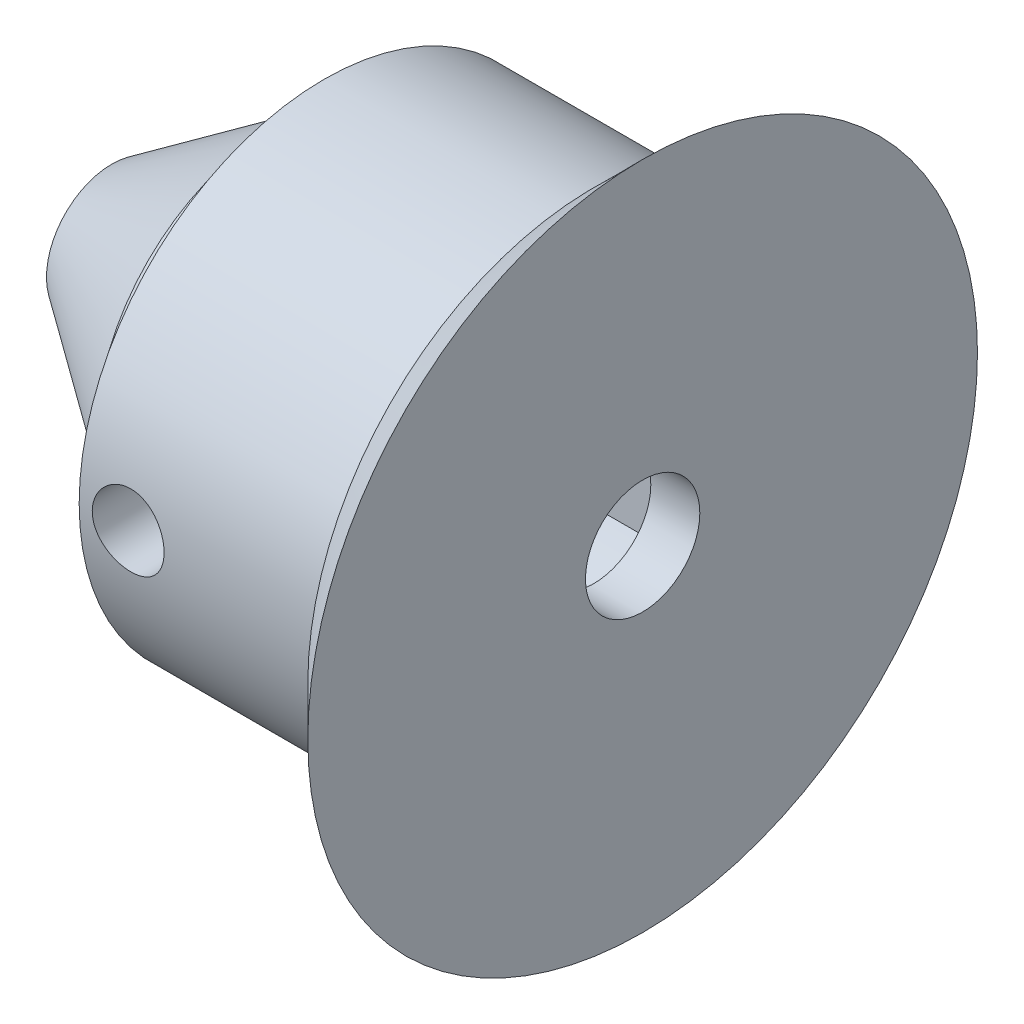
ISO-10303-21;
HEADER;
FILE_DESCRIPTION(('STEP AP214'),'2;1');
FILE_NAME('part.step','',(''),(''),'','','');
FILE_SCHEMA(('AUTOMOTIVE_DESIGN { 1 0 10303 214 1 1 1 1 }'));
ENDSEC;
DATA;
#1=APPLICATION_CONTEXT('core data for automotive mechanical design processes');
#2=APPLICATION_PROTOCOL_DEFINITION('international standard','automotive_design',2000,#1);
#3=PRODUCT_CONTEXT('',#1,'mechanical');
#4=PRODUCT('Part','Part','',(#3));
#5=PRODUCT_RELATED_PRODUCT_CATEGORY('part','',(#4));
#6=PRODUCT_DEFINITION_FORMATION('','',#4);
#7=PRODUCT_DEFINITION_CONTEXT('part definition',#1,'design');
#8=PRODUCT_DEFINITION('design','',#6,#7);
#9=PRODUCT_DEFINITION_SHAPE('','',#8);
#10=(LENGTH_UNIT() NAMED_UNIT(*) SI_UNIT(.MILLI.,.METRE.));
#11=(NAMED_UNIT(*) PLANE_ANGLE_UNIT() SI_UNIT($,.RADIAN.));
#12=(NAMED_UNIT(*) SI_UNIT($,.STERADIAN.) SOLID_ANGLE_UNIT());
#13=UNCERTAINTY_MEASURE_WITH_UNIT(LENGTH_MEASURE(1.E-05),#10,'distance_accuracy_value','');
#14=(GEOMETRIC_REPRESENTATION_CONTEXT(3) GLOBAL_UNCERTAINTY_ASSIGNED_CONTEXT((#13)) GLOBAL_UNIT_ASSIGNED_CONTEXT((#10,
#11,#12)) REPRESENTATION_CONTEXT('',''));
#15=CARTESIAN_POINT('',(0.,0.,0.));
#16=DIRECTION('',(0.,0.,1.));
#17=DIRECTION('',(1.,0.,0.));
#18=AXIS2_PLACEMENT_3D('',#15,#16,#17);
#19=CARTESIAN_POINT('',(1.00000000000001,0.,-125.));
#20=DIRECTION('',(1.,0.,0.));
#21=DIRECTION('',(0.,0.,-1.));
#22=AXIS2_PLACEMENT_3D('',#19,#20,#21);
#23=PLANE('',#22);
#24=CARTESIAN_POINT('',(1.00000000000001,0.,-125.));
#25=DIRECTION('',(1.,0.,0.));
#26=DIRECTION('',(0.,0.,-1.));
#27=AXIS2_PLACEMENT_3D('',#24,#25,#26);
#28=CIRCLE('',#27,7.50000000000001);
#29=CARTESIAN_POINT('',(1.00000000000001,0.,-132.5));
#30=VERTEX_POINT('',#29);
#31=EDGE_CURVE('E118',#30,#30,#28,.F.);
#32=ORIENTED_EDGE('',*,*,#31,.F.);
#33=EDGE_LOOP('',(#32));
#34=FACE_BOUND('',#33,.T.);
#35=CARTESIAN_POINT('',(1.00000000000001,0.,-125.));
#36=DIRECTION('',(-1.,0.,0.));
#37=DIRECTION('',(0.,0.,1.));
#38=AXIS2_PLACEMENT_3D('',#35,#36,#37);
#39=CIRCLE('',#38,8.74999999999998);
#40=CARTESIAN_POINT('',(1.00000000000001,0.,-116.25));
#41=VERTEX_POINT('',#40);
#42=EDGE_CURVE('E259',#41,#41,#39,.T.);
#43=ORIENTED_EDGE('',*,*,#42,.T.);
#44=EDGE_LOOP('',(#43));
#45=FACE_BOUND('',#44,.T.);
#46=ADVANCED_FACE('F39',(#34,#45),#23,.F.);
#47=CARTESIAN_POINT('',(2.50000000000001,0.,-125.));
#48=DIRECTION('',(1.,0.,0.));
#49=DIRECTION('',(0.,0.,-1.));
#50=AXIS2_PLACEMENT_3D('',#47,#48,#49);
#51=PLANE('',#50);
#52=CARTESIAN_POINT('',(2.50000000000001,0.,-125.));
#53=DIRECTION('',(1.,0.,0.));
#54=DIRECTION('',(0.,0.,-1.));
#55=AXIS2_PLACEMENT_3D('',#52,#53,#54);
#56=CIRCLE('',#55,1.75000000000001);
#57=CARTESIAN_POINT('',(2.50000000000001,0.,-126.75));
#58=VERTEX_POINT('',#57);
#59=EDGE_CURVE('E130',#58,#58,#56,.T.);
#60=ORIENTED_EDGE('',*,*,#59,.F.);
#61=EDGE_LOOP('',(#60));
#62=FACE_BOUND('',#61,.T.);
#63=CARTESIAN_POINT('',(2.50000000000001,0.,-125.));
#64=DIRECTION('',(-1.,0.,0.));
#65=DIRECTION('',(0.,0.,1.));
#66=AXIS2_PLACEMENT_3D('',#63,#64,#65);
#67=CIRCLE('',#66,10.25);
#68=CARTESIAN_POINT('',(2.50000000000001,0.,-114.75));
#69=VERTEX_POINT('',#68);
#70=EDGE_CURVE('E262',#69,#69,#67,.T.);
#71=ORIENTED_EDGE('',*,*,#70,.F.);
#72=EDGE_LOOP('',(#71));
#73=FACE_BOUND('',#72,.T.);
#74=ADVANCED_FACE('F178',(#62,#73),#51,.T.);
#75=CARTESIAN_POINT('',(-7.24999999999999,0.,-125.));
#76=DIRECTION('',(-1.,0.,0.));
#77=DIRECTION('',(0.,0.,1.));
#78=AXIS2_PLACEMENT_3D('',#75,#76,#77);
#79=PLANE('',#78);
#80=CARTESIAN_POINT('',(-7.24999999999999,0.,-125.));
#81=DIRECTION('',(-1.,0.,0.));
#82=DIRECTION('',(0.,0.,1.));
#83=AXIS2_PLACEMENT_3D('',#80,#81,#82);
#84=CIRCLE('',#83,7.43649167310373);
#85=CARTESIAN_POINT('',(-7.24999999999999,0.,-117.563508326896));
#86=VERTEX_POINT('',#85);
#87=EDGE_CURVE('E11',#86,#86,#84,.F.);
#88=ORIENTED_EDGE('',*,*,#87,.T.);
#89=EDGE_LOOP('',(#88));
#90=FACE_BOUND('',#89,.T.);
#91=CARTESIAN_POINT('',(-7.24999999999999,0.,-125.));
#92=DIRECTION('',(-1.,0.,0.));
#93=DIRECTION('',(0.,0.,1.));
#94=AXIS2_PLACEMENT_3D('',#91,#92,#93);
#95=CIRCLE('',#94,7.50000000000001);
#96=CARTESIAN_POINT('',(-7.24999999999999,0.,-117.5));
#97=VERTEX_POINT('',#96);
#98=EDGE_CURVE('E115',#97,#97,#95,.T.);
#99=ORIENTED_EDGE('',*,*,#98,.T.);
#100=EDGE_LOOP('',(#99));
#101=FACE_BOUND('',#100,.T.);
#102=ADVANCED_FACE('F163',(#90,#101),#79,.T.);
#103=CARTESIAN_POINT('',(-7.24999999999999,0.,-125.));
#104=DIRECTION('',(1.,0.,0.));
#105=DIRECTION('',(0.,0.,-1.));
#106=AXIS2_PLACEMENT_3D('',#103,#104,#105);
#107=CYLINDRICAL_SURFACE('',#106,7.50000000000001);
#108=CARTESIAN_POINT('',(-6.85000000000008,0.,-132.5));
#109=CARTESIAN_POINT('',(-6.84999745450659,-0.0614339137792255,-132.499999030787));
#110=CARTESIAN_POINT('',(-6.84483609331787,-0.122903869751573,-132.499237255416));
#111=CARTESIAN_POINT('',(-6.82433161957585,-0.244126707027792,-132.496271691436));
#112=CARTESIAN_POINT('',(-6.80897849003577,-0.303877838643947,-132.494066484179));
#113=CARTESIAN_POINT('',(-6.76855817346136,-0.419891057921687,-132.488461960141));
#114=CARTESIAN_POINT('',(-6.74349821399991,-0.476155705499527,-132.485063531991));
#115=CARTESIAN_POINT('',(-6.68439300672256,-0.58367231870227,-132.477448441539));
#116=CARTESIAN_POINT('',(-6.65034904859367,-0.634925002367341,-132.473231896704));
#117=CARTESIAN_POINT('',(-6.57397070710746,-0.731355183041636,-132.46441445772));
#118=CARTESIAN_POINT('',(-6.53158239144177,-0.776489749189181,-132.459811181282));
#119=CARTESIAN_POINT('',(-6.43983461847358,-0.859032180642691,-132.45075782264));
#120=CARTESIAN_POINT('',(-6.39047476738573,-0.8964396091892,-132.446307749107));
#121=CARTESIAN_POINT('',(-6.28589789762733,-0.962632049862314,-132.43804150204));
#122=CARTESIAN_POINT('',(-6.23065443714606,-0.991375704507373,-132.434228406576));
#123=CARTESIAN_POINT('',(-6.11605869433848,-1.03916040032448,-132.427700241209));
#124=CARTESIAN_POINT('',(-6.0567066262178,-1.05820194689179,-132.424985114114));
#125=CARTESIAN_POINT('',(-5.93602919873202,-1.08590896566669,-132.420983644297));
#126=CARTESIAN_POINT('',(-5.8747210253202,-1.09464780616288,-132.41968720355));
#127=CARTESIAN_POINT('',(-5.75149577603954,-1.10172860035277,-132.418639207815));
#128=CARTESIAN_POINT('',(-5.68957873380408,-1.10007112514448,-132.418887567967));
#129=CARTESIAN_POINT('',(-5.56741061922417,-1.08646633340055,-132.420891876832));
#130=CARTESIAN_POINT('',(-5.50715023723435,-1.074600601277,-132.422635872076));
#131=CARTESIAN_POINT('',(-5.38948512563443,-1.0410437721177,-132.427416279055));
#132=CARTESIAN_POINT('',(-5.3320804735986,-1.01935240833591,-132.430452725878));
#133=CARTESIAN_POINT('',(-5.22150735490083,-0.9666747959219,-132.437489160171));
#134=CARTESIAN_POINT('',(-5.16835564981902,-0.935653862230755,-132.441492732051));
#135=CARTESIAN_POINT('',(-5.06798114469064,-0.865222397580546,-132.450009700513));
#136=CARTESIAN_POINT('',(-5.0207587172038,-0.825811339856102,-132.454523129098));
#137=CARTESIAN_POINT('',(-4.93311030226506,-0.739269913176588,-132.463604124608));
#138=CARTESIAN_POINT('',(-4.89275357694302,-0.692069374554425,-132.468171796712));
#139=CARTESIAN_POINT('',(-4.82052403202057,-0.591528341776189,-132.476806520571));
#140=CARTESIAN_POINT('',(-4.78865124667911,-0.538187822827544,-132.480873570305));
#141=CARTESIAN_POINT('',(-4.73429127768072,-0.426821886355059,-132.488052785917));
#142=CARTESIAN_POINT('',(-4.71180929323904,-0.368793894772148,-132.49116442258));
#143=CARTESIAN_POINT('',(-4.67692856753027,-0.249730300005073,-132.496077746059));
#144=CARTESIAN_POINT('',(-4.66452917482272,-0.18869489140167,-132.497879517505));
#145=CARTESIAN_POINT('',(-4.65025737076766,-0.0659469706202578,-132.499958921715));
#146=CARTESIAN_POINT('',(-4.64828971106266,-0.00424575780937643,-132.500250344374));
#147=CARTESIAN_POINT('',(-4.65468461791224,0.118605719627989,-132.499313709263));
#148=CARTESIAN_POINT('',(-4.66304687912231,0.179756000485778,-132.498085696407));
#149=CARTESIAN_POINT('',(-4.68978505890037,0.299482343134793,-132.49425670441));
#150=CARTESIAN_POINT('',(-4.70811471466488,0.358068956985495,-132.491662070058));
#151=CARTESIAN_POINT('',(-4.75421868467456,0.471337351522008,-132.485389882059));
#152=CARTESIAN_POINT('',(-4.78199342547551,0.526018955716098,-132.481712279503));
#153=CARTESIAN_POINT('',(-4.84642360158273,0.630344895974966,-132.473648726699));
#154=CARTESIAN_POINT('',(-4.88313962835929,0.679951436879123,-132.469258014652));
#155=CARTESIAN_POINT('',(-4.96432559086452,0.772332556824692,-132.460272158925));
#156=CARTESIAN_POINT('',(-5.00879595640615,0.815106756906359,-132.455677003922));
#157=CARTESIAN_POINT('',(-5.10465165283744,0.89295433674454,-132.446756604834));
#158=CARTESIAN_POINT('',(-5.15608901732887,0.927963966645664,-132.442433789802));
#159=CARTESIAN_POINT('',(-5.26417027436009,0.988845883817523,-132.434590106161));
#160=CARTESIAN_POINT('',(-5.32081403109359,1.01471840934016,-132.431069216643));
#161=CARTESIAN_POINT('',(-5.43750783724652,1.05649225011171,-132.425245480752));
#162=CARTESIAN_POINT('',(-5.49754553929879,1.07242745544987,-132.422938498738));
#163=CARTESIAN_POINT('',(-5.61948129359889,1.09398237497283,-132.419792666895));
#164=CARTESIAN_POINT('',(-5.68137922322863,1.09960276755589,-132.418953720513));
#165=CARTESIAN_POINT('',(-5.80464315338407,1.10035290779075,-132.418842444497));
#166=CARTESIAN_POINT('',(-5.86600855407804,1.0955828767175,-132.419555148319));
#167=CARTESIAN_POINT('',(-5.98705450811897,1.07590197796449,-132.422434392605));
#168=CARTESIAN_POINT('',(-6.04673506370101,1.06099112373807,-132.424600931139));
#169=CARTESIAN_POINT('',(-6.16269151571734,1.02148671040963,-132.430138584406));
#170=CARTESIAN_POINT('',(-6.21896973588042,0.996899848024539,-132.433508865886));
#171=CARTESIAN_POINT('',(-6.32661846759246,0.938751285001513,-132.441075319772));
#172=CARTESIAN_POINT('',(-6.3779888276742,0.905189307493385,-132.445271517657));
#173=CARTESIAN_POINT('',(-6.47487330375488,0.829677941083677,-132.45406523526));
#174=CARTESIAN_POINT('',(-6.52032920813704,0.787654244466669,-132.458666091315));
#175=CARTESIAN_POINT('',(-6.60357980840706,0.696569291934379,-132.467722637777));
#176=CARTESIAN_POINT('',(-6.64137271800963,0.647506399685665,-132.472178294134));
#177=CARTESIAN_POINT('',(-6.70840084315868,0.5434335185663,-132.480469035419));
#178=CARTESIAN_POINT('',(-6.73759008473408,0.488393657059063,-132.484300739208));
#179=CARTESIAN_POINT('',(-6.78626660494689,0.374163072803729,-132.490878589152));
#180=CARTESIAN_POINT('',(-6.80576400331312,0.314976753586264,-132.493625866988));
#181=CARTESIAN_POINT('',(-6.8300448566787,0.212932358081481,-132.49709312323));
#182=CARTESIAN_POINT('',(-6.83751669863468,0.170706280118832,-132.498177645367));
#183=CARTESIAN_POINT('',(-6.84749512894482,0.0856593052075387,-132.499631417517));
#184=CARTESIAN_POINT('',(-6.85000177499536,0.0428384151765289,-132.500000675841));
#185=CARTESIAN_POINT('',(-6.85000000000008,0.,-132.5));
#186=B_SPLINE_CURVE_WITH_KNOTS('',3,(#108,#109,#110,#111,#112,#113,#114,#115,#116,#117,#118,
#119,#120,#121,#122,#123,#124,#125,#126,#127,#128,#129,#130,#131,#132,#133,#134,#135,#136,#137,
#138,#139,#140,#141,#142,#143,#144,#145,#146,#147,#148,#149,#150,#151,#152,#153,#154,#155,#156,
#157,#158,#159,#160,#161,#162,#163,#164,#165,#166,#167,#168,#169,#170,#171,#172,#173,#174,#175,
#176,#177,#178,#179,#180,#181,#182,#183,#184,#185),.UNSPECIFIED.,.T.,.F.,(4,2,2,2,2,2,2,2,2,2,2,
2,2,2,2,2,2,2,2,2,2,2,2,2,2,2,2,2,2,2,2,2,2,2,2,2,2,2,4),(0.,0.184145214135645,
0.368471684025479,0.552661169958336,0.736824229163183,0.922219175599117,1.10762459821091,
1.29390154601942,1.48016878943053,1.66510140488703,1.85002386157894,2.03348200306703,
2.21694512537133,2.40109893203312,2.58526430401544,2.77118963521338,2.95711571718387,
3.14314460109183,3.32916146464068,3.51347691345021,3.69778691416735,3.8812486681505,
4.0647187086728,4.24946845023511,4.4342284354933,4.62045340203654,4.80667351236636,
4.99225501652602,5.17782431467818,5.36161162819954,5.54539869789972,5.72905879255056,
5.9127245535213,6.09807966640001,6.28347793700445,6.46984963984061,6.65602633191714,
6.78443392176047,6.91284001947813),.UNSPECIFIED.);
#187=CARTESIAN_POINT('',(-6.85000000000008,0.,-132.5));
#188=VERTEX_POINT('',#187);
#189=EDGE_CURVE('E135',#188,#188,#186,.T.);
#190=ORIENTED_EDGE('',*,*,#189,.T.);
#191=EDGE_LOOP('',(#190));
#192=FACE_BOUND('',#191,.T.);
#193=CARTESIAN_POINT('',(-4.65000000000008,0.,-117.5));
#194=CARTESIAN_POINT('',(-4.65000254549357,-0.0614339137792255,-117.500000969213));
#195=CARTESIAN_POINT('',(-4.6551639066823,-0.122903869751573,-117.500762744584));
#196=CARTESIAN_POINT('',(-4.67566838042432,-0.244126707027792,-117.503728308564));
#197=CARTESIAN_POINT('',(-4.69102150996439,-0.303877838643947,-117.505933515821));
#198=CARTESIAN_POINT('',(-4.7314418265388,-0.419891057921686,-117.511538039859));
#199=CARTESIAN_POINT('',(-4.75650178600025,-0.476155705499526,-117.514936468009));
#200=CARTESIAN_POINT('',(-4.8156069932776,-0.583672318702269,-117.522551558461));
#201=CARTESIAN_POINT('',(-4.8496509514065,-0.63492500236734,-117.526768103296));
#202=CARTESIAN_POINT('',(-4.92602929289271,-0.731355183041635,-117.53558554228));
#203=CARTESIAN_POINT('',(-4.9684176085584,-0.776489749189181,-117.540188818718));
#204=CARTESIAN_POINT('',(-5.06016538152659,-0.859032180642691,-117.54924217736));
#205=CARTESIAN_POINT('',(-5.10952523261443,-0.8964396091892,-117.553692250893));
#206=CARTESIAN_POINT('',(-5.21410210237283,-0.962632049862313,-117.56195849796));
#207=CARTESIAN_POINT('',(-5.2693455628541,-0.991375704507372,-117.565771593424));
#208=CARTESIAN_POINT('',(-5.38394130566168,-1.03916040032448,-117.572299758791));
#209=CARTESIAN_POINT('',(-5.44329337378236,-1.05820194689179,-117.575014885886));
#210=CARTESIAN_POINT('',(-5.56397080126814,-1.08590896566669,-117.579016355703));
#211=CARTESIAN_POINT('',(-5.62527897467996,-1.09464780616288,-117.58031279645));
#212=CARTESIAN_POINT('',(-5.74850422396062,-1.10172860035277,-117.581360792185));
#213=CARTESIAN_POINT('',(-5.81042126619608,-1.10007112514448,-117.581112432033));
#214=CARTESIAN_POINT('',(-5.93258938077599,-1.08646633340055,-117.579108123168));
#215=CARTESIAN_POINT('',(-5.99284976276582,-1.074600601277,-117.577364127924));
#216=CARTESIAN_POINT('',(-6.11051487436573,-1.0410437721177,-117.572583720945));
#217=CARTESIAN_POINT('',(-6.16791952640156,-1.01935240833592,-117.569547274122));
#218=CARTESIAN_POINT('',(-6.27849264509933,-0.966674795921899,-117.562510839829));
#219=CARTESIAN_POINT('',(-6.33164435018114,-0.935653862230754,-117.558507267949));
#220=CARTESIAN_POINT('',(-6.43201885530952,-0.865222397580546,-117.549990299487));
#221=CARTESIAN_POINT('',(-6.47924128279636,-0.825811339856102,-117.545476870902));
#222=CARTESIAN_POINT('',(-6.5668896977351,-0.739269913176589,-117.536395875392));
#223=CARTESIAN_POINT('',(-6.60724642305714,-0.692069374554426,-117.531828203288));
#224=CARTESIAN_POINT('',(-6.67947596797959,-0.591528341776189,-117.523193479429));
#225=CARTESIAN_POINT('',(-6.71134875332105,-0.538187822827545,-117.519126429695));
#226=CARTESIAN_POINT('',(-6.76570872231944,-0.426821886355061,-117.511947214083));
#227=CARTESIAN_POINT('',(-6.78819070676112,-0.36879389477215,-117.50883557742));
#228=CARTESIAN_POINT('',(-6.8230714324699,-0.249730300005073,-117.503922253941));
#229=CARTESIAN_POINT('',(-6.83547082517745,-0.188694891401669,-117.502120482495));
#230=CARTESIAN_POINT('',(-6.8497426292325,-0.0659469706202565,-117.500041078285));
#231=CARTESIAN_POINT('',(-6.8517102889375,-0.00424575780937529,-117.499749655626));
#232=CARTESIAN_POINT('',(-6.84531538208792,0.118605719627989,-117.500686290737));
#233=CARTESIAN_POINT('',(-6.83695312087785,0.179756000485778,-117.501914303593));
#234=CARTESIAN_POINT('',(-6.8102149410998,0.299482343134793,-117.50574329559));
#235=CARTESIAN_POINT('',(-6.79188528533528,0.358068956985495,-117.508337929942));
#236=CARTESIAN_POINT('',(-6.7457813153256,0.471337351522009,-117.514610117941));
#237=CARTESIAN_POINT('',(-6.71800657452465,0.526018955716099,-117.518287720497));
#238=CARTESIAN_POINT('',(-6.65357639841743,0.630344895974966,-117.526351273301));
#239=CARTESIAN_POINT('',(-6.61686037164087,0.679951436879122,-117.530741985348));
#240=CARTESIAN_POINT('',(-6.53567440913564,0.77233255682469,-117.539727841075));
#241=CARTESIAN_POINT('',(-6.49120404359401,0.815106756906359,-117.544322996078));
#242=CARTESIAN_POINT('',(-6.39534834716272,0.89295433674454,-117.553243395166));
#243=CARTESIAN_POINT('',(-6.3439109826713,0.927963966645664,-117.557566210198));
#244=CARTESIAN_POINT('',(-6.23582972564007,0.988845883817523,-117.565409893839));
#245=CARTESIAN_POINT('',(-6.17918596890657,1.01471840934016,-117.568930783357));
#246=CARTESIAN_POINT('',(-6.06249216275364,1.05649225011172,-117.574754519248));
#247=CARTESIAN_POINT('',(-6.00245446070137,1.07242745544987,-117.577061501261));
#248=CARTESIAN_POINT('',(-5.88051870640127,1.09398237497283,-117.580207333105));
#249=CARTESIAN_POINT('',(-5.81862077677153,1.09960276755589,-117.581046279487));
#250=CARTESIAN_POINT('',(-5.69535684661609,1.10035290779075,-117.581157555503));
#251=CARTESIAN_POINT('',(-5.63399144592212,1.0955828767175,-117.580444851681));
#252=CARTESIAN_POINT('',(-5.51294549188119,1.07590197796449,-117.577565607395));
#253=CARTESIAN_POINT('',(-5.45326493629915,1.06099112373807,-117.575399068861));
#254=CARTESIAN_POINT('',(-5.33730848428282,1.02148671040963,-117.569861415594));
#255=CARTESIAN_POINT('',(-5.28103026411974,0.996899848024538,-117.566491134114));
#256=CARTESIAN_POINT('',(-5.1733815324077,0.938751285001512,-117.558924680228));
#257=CARTESIAN_POINT('',(-5.12201117232597,0.905189307493384,-117.554728482343));
#258=CARTESIAN_POINT('',(-5.02512669624529,0.829677941083677,-117.54593476474));
#259=CARTESIAN_POINT('',(-4.97967079186312,0.787654244466668,-117.541333908685));
#260=CARTESIAN_POINT('',(-4.8964201915931,0.696569291934377,-117.532277362223));
#261=CARTESIAN_POINT('',(-4.85862728199053,0.647506399685663,-117.527821705866));
#262=CARTESIAN_POINT('',(-4.79159915684148,0.543433518566299,-117.519530964581));
#263=CARTESIAN_POINT('',(-4.76240991526608,0.488393657059063,-117.515699260792));
#264=CARTESIAN_POINT('',(-4.71373339505327,0.37416307280373,-117.509121410848));
#265=CARTESIAN_POINT('',(-4.69423599668704,0.314976753586264,-117.506374133012));
#266=CARTESIAN_POINT('',(-4.66995514332146,0.212932358081481,-117.50290687677));
#267=CARTESIAN_POINT('',(-4.66248330136548,0.170706280118833,-117.501822354633));
#268=CARTESIAN_POINT('',(-4.65250487105534,0.0856593052075389,-117.500368582483));
#269=CARTESIAN_POINT('',(-4.6499982250048,0.042838415176529,-117.499999324159));
#270=CARTESIAN_POINT('',(-4.65000000000008,0.,-117.5));
#271=B_SPLINE_CURVE_WITH_KNOTS('',3,(#193,#194,#195,#196,#197,#198,#199,#200,#201,#202,#203,
#204,#205,#206,#207,#208,#209,#210,#211,#212,#213,#214,#215,#216,#217,#218,#219,#220,#221,#222,
#223,#224,#225,#226,#227,#228,#229,#230,#231,#232,#233,#234,#235,#236,#237,#238,#239,#240,#241,
#242,#243,#244,#245,#246,#247,#248,#249,#250,#251,#252,#253,#254,#255,#256,#257,#258,#259,#260,
#261,#262,#263,#264,#265,#266,#267,#268,#269,#270),.UNSPECIFIED.,.T.,.F.,(4,2,2,2,2,2,2,2,2,2,2,
2,2,2,2,2,2,2,2,2,2,2,2,2,2,2,2,2,2,2,2,2,2,2,2,2,2,2,4),(0.,0.184145214135645,
0.368471684025478,0.552661169958332,0.736824229163182,0.922219175599116,1.10762459821091,
1.29390154601942,1.48016878943053,1.66510140488703,1.85002386157894,2.03348200306703,
2.21694512537133,2.40109893203312,2.58526430401544,2.77118963521338,2.95711571718387,
3.14314460109182,3.32916146464068,3.51347691345021,3.69778691416735,3.8812486681505,
4.0647187086728,4.24946845023511,4.4342284354933,4.62045340203654,4.80667351236636,
4.99225501652602,5.17782431467818,5.36161162819954,5.54539869789972,5.72905879255057,
5.91272455352131,6.09807966640001,6.28347793700445,6.46984963984061,6.65602633191713,
6.78443392176047,6.91284001947813),.UNSPECIFIED.);
#272=CARTESIAN_POINT('',(-4.65000000000008,0.,-117.5));
#273=VERTEX_POINT('',#272);
#274=EDGE_CURVE('E227',#273,#273,#271,.T.);
#275=ORIENTED_EDGE('',*,*,#274,.T.);
#276=EDGE_LOOP('',(#275));
#277=FACE_BOUND('',#276,.T.);
#278=ORIENTED_EDGE('',*,*,#98,.F.);
#279=EDGE_LOOP('',(#278));
#280=FACE_BOUND('',#279,.T.);
#281=ORIENTED_EDGE('',*,*,#31,.T.);
#282=EDGE_LOOP('',(#281));
#283=FACE_BOUND('',#282,.T.);
#284=ADVANCED_FACE('F177',(#192,#277,#280,#283),#107,.T.);
#285=CARTESIAN_POINT('',(-9.24999999999999,0.,-125.));
#286=DIRECTION('',(-1.,0.,0.));
#287=DIRECTION('',(0.,0.,1.));
#288=AXIS2_PLACEMENT_3D('',#285,#286,#287);
#289=TOROIDAL_SURFACE('',#288,7.43649167310373,2.);
#290=ORIENTED_EDGE('',*,*,#87,.F.);
#291=EDGE_LOOP('',(#290));
#292=FACE_BOUND('',#291,.T.);
#293=CARTESIAN_POINT('',(-8.75000000000008,0.,-125.));
#294=DIRECTION('',(-1.,0.,0.));
#295=DIRECTION('',(0.,0.,1.));
#296=AXIS2_PLACEMENT_3D('',#293,#294,#295);
#297=CIRCLE('',#296,5.5);
#298=CARTESIAN_POINT('',(-8.75000000000008,0.,-119.5));
#299=VERTEX_POINT('',#298);
#300=EDGE_CURVE('E106',#299,#299,#297,.T.);
#301=ORIENTED_EDGE('',*,*,#300,.F.);
#302=EDGE_LOOP('',(#301));
#303=FACE_BOUND('',#302,.T.);
#304=ADVANCED_FACE('F41',(#292,#303),#289,.F.);
#305=CARTESIAN_POINT('',(-8.75000000000008,0.,-125.));
#306=DIRECTION('',(1.,0.,0.));
#307=DIRECTION('',(0.,1.,0.));
#308=AXIS2_PLACEMENT_3D('',#305,#306,#307);
#309=CONICAL_SURFACE('',#308,5.5,0.610725964389209);
#310=CARTESIAN_POINT('',(-13.7500000000001,0.,-125.));
#311=DIRECTION('',(1.,0.,0.));
#312=DIRECTION('',(0.,1.,0.));
#313=AXIS2_PLACEMENT_3D('',#310,#311,#312);
#314=CIRCLE('',#313,2.);
#315=CARTESIAN_POINT('',(-13.7500000000001,2.,-125.));
#316=VERTEX_POINT('',#315);
#317=EDGE_CURVE('E127',#316,#316,#314,.T.);
#318=ORIENTED_EDGE('',*,*,#317,.T.);
#319=EDGE_LOOP('',(#318));
#320=FACE_BOUND('',#319,.T.);
#321=ORIENTED_EDGE('',*,*,#300,.T.);
#322=EDGE_LOOP('',(#321));
#323=FACE_BOUND('',#322,.T.);
#324=ADVANCED_FACE('F216',(#320,#323),#309,.T.);
#325=CARTESIAN_POINT('',(-13.7500000000001,0.,-125.));
#326=DIRECTION('',(-1.,0.,0.));
#327=DIRECTION('',(0.,-1.,0.));
#328=AXIS2_PLACEMENT_3D('',#325,#326,#327);
#329=PLANE('',#328);
#330=CARTESIAN_POINT('',(-13.7500000000001,0.,-125.));
#331=DIRECTION('',(1.,0.,0.));
#332=DIRECTION('',(0.,0.,-1.));
#333=AXIS2_PLACEMENT_3D('',#330,#331,#332);
#334=CIRCLE('',#333,1.75000000000001);
#335=CARTESIAN_POINT('',(-13.7500000000001,0.,-126.75));
#336=VERTEX_POINT('',#335);
#337=EDGE_CURVE('E123',#336,#336,#334,.T.);
#338=ORIENTED_EDGE('',*,*,#337,.T.);
#339=EDGE_LOOP('',(#338));
#340=FACE_BOUND('',#339,.T.);
#341=ORIENTED_EDGE('',*,*,#317,.F.);
#342=EDGE_LOOP('',(#341));
#343=FACE_BOUND('',#342,.T.);
#344=ADVANCED_FACE('F213',(#340,#343),#329,.T.);
#345=CARTESIAN_POINT('',(-13.7500000000001,0.,-125.));
#346=DIRECTION('',(1.,0.,0.));
#347=DIRECTION('',(0.,0.,-1.));
#348=AXIS2_PLACEMENT_3D('',#345,#346,#347);
#349=CYLINDRICAL_SURFACE('',#348,1.75000000000001);
#350=CARTESIAN_POINT('',(-8.75000000000008,0.,-125.));
#351=DIRECTION('',(1.,0.,0.));
#352=DIRECTION('',(0.,1.,0.));
#353=AXIS2_PLACEMENT_3D('',#350,#351,#352);
#354=CIRCLE('',#353,1.75000000000001);
#355=CARTESIAN_POINT('',(-8.75000000000008,1.75000000000001,-125.));
#356=VERTEX_POINT('',#355);
#357=EDGE_CURVE('E120',#356,#356,#354,.T.);
#358=ORIENTED_EDGE('',*,*,#357,.T.);
#359=EDGE_LOOP('',(#358));
#360=FACE_BOUND('',#359,.T.);
#361=ORIENTED_EDGE('',*,*,#337,.F.);
#362=EDGE_LOOP('',(#361));
#363=FACE_BOUND('',#362,.T.);
#364=ADVANCED_FACE('F171',(#360,#363),#349,.F.);
#365=ORIENTED_EDGE('',*,*,#59,.T.);
#366=EDGE_LOOP('',(#365));
#367=FACE_BOUND('',#366,.T.);
#368=CARTESIAN_POINT('',(1.00000000000001,0.,-125.));
#369=DIRECTION('',(1.,0.,0.));
#370=DIRECTION('',(0.,0.,-1.));
#371=AXIS2_PLACEMENT_3D('',#368,#369,#370);
#372=CIRCLE('',#371,1.75000000000001);
#373=CARTESIAN_POINT('',(1.00000000000001,0.,-126.75));
#374=VERTEX_POINT('',#373);
#375=EDGE_CURVE('E122',#374,#374,#372,.T.);
#376=ORIENTED_EDGE('',*,*,#375,.F.);
#377=EDGE_LOOP('',(#376));
#378=FACE_BOUND('',#377,.T.);
#379=ADVANCED_FACE('F160',(#367,#378),#349,.F.);
#380=DIRECTION('',(0.,-1.,0.));
#381=VECTOR('',#380,1.);
#382=CARTESIAN_POINT('',(-7.24999999999999,3.21130814466629,-128.5));
#383=LINE('',#382,#381);
#384=CARTESIAN_POINT('',(-7.24999999999999,3.21130814466629,-128.5));
#385=VERTEX_POINT('',#384);
#386=CARTESIAN_POINT('',(-7.24999999999999,-3.21130814466629,-128.5));
#387=VERTEX_POINT('',#386);
#388=EDGE_CURVE('E87',#385,#387,#383,.T.);
#389=ORIENTED_EDGE('',*,*,#388,.F.);
#390=CARTESIAN_POINT('',(-7.24999999999999,0.,-125.));
#391=DIRECTION('',(-1.,0.,0.));
#392=DIRECTION('',(0.,0.,1.));
#393=AXIS2_PLACEMENT_3D('',#390,#391,#392);
#394=CIRCLE('',#393,4.75);
#395=EDGE_CURVE('E48',#385,#387,#394,.T.);
#396=ORIENTED_EDGE('',*,*,#395,.T.);
#397=EDGE_LOOP('',(#389,#396));
#398=FACE_BOUND('',#397,.T.);
#399=ADVANCED_FACE('F158',(#398),#79,.T.);
#400=CARTESIAN_POINT('',(-7.24999999999999,3.21130814466629,-128.5));
#401=DIRECTION('',(0.,0.,1.));
#402=DIRECTION('',(1.,0.,0.));
#403=AXIS2_PLACEMENT_3D('',#400,#401,#402);
#404=PLANE('',#403);
#405=CARTESIAN_POINT('',(-5.75000000000008,0.,-128.5));
#406=DIRECTION('',(0.,0.,1.));
#407=DIRECTION('',(1.,0.,0.));
#408=AXIS2_PLACEMENT_3D('',#405,#406,#407);
#409=CIRCLE('',#408,1.1);
#410=CARTESIAN_POINT('',(-4.65000000000008,0.,-128.5));
#411=VERTEX_POINT('',#410);
#412=EDGE_CURVE('E233',#411,#411,#409,.T.);
#413=ORIENTED_EDGE('',*,*,#412,.F.);
#414=EDGE_LOOP('',(#413));
#415=FACE_BOUND('',#414,.T.);
#416=DIRECTION('',(0.,-1.,0.));
#417=VECTOR('',#416,1.);
#418=CARTESIAN_POINT('',(1.00000000000001,3.21130814466629,-128.5));
#419=LINE('',#418,#417);
#420=CARTESIAN_POINT('',(1.00000000000001,3.21130814466629,-128.5));
#421=VERTEX_POINT('',#420);
#422=CARTESIAN_POINT('',(1.00000000000001,-3.21130814466628,-128.5));
#423=VERTEX_POINT('',#422);
#424=EDGE_CURVE('E83',#421,#423,#419,.T.);
#425=ORIENTED_EDGE('',*,*,#424,.F.);
#426=DIRECTION('',(1.,0.,0.));
#427=VECTOR('',#426,1.);
#428=CARTESIAN_POINT('',(-7.24999999999999,3.21130814466629,-128.5));
#429=LINE('',#428,#427);
#430=EDGE_CURVE('E90',#385,#421,#429,.T.);
#431=ORIENTED_EDGE('',*,*,#430,.F.);
#432=ORIENTED_EDGE('',*,*,#388,.T.);
#433=DIRECTION('',(1.,0.,0.));
#434=VECTOR('',#433,1.);
#435=CARTESIAN_POINT('',(-7.24999999999999,-3.21130814466628,-128.5));
#436=LINE('',#435,#434);
#437=EDGE_CURVE('E78',#387,#423,#436,.T.);
#438=ORIENTED_EDGE('',*,*,#437,.T.);
#439=EDGE_LOOP('',(#425,#431,#432,#438));
#440=FACE_BOUND('',#439,.T.);
#441=ADVANCED_FACE('F80',(#415,#440),#404,.T.);
#442=DIRECTION('',(0.,1.,0.));
#443=VECTOR('',#442,1.);
#444=CARTESIAN_POINT('',(-7.24999999999999,3.2113081446663,-121.5));
#445=LINE('',#444,#443);
#446=CARTESIAN_POINT('',(-7.24999999999999,-3.2113081446663,-121.5));
#447=VERTEX_POINT('',#446);
#448=CARTESIAN_POINT('',(-7.24999999999999,3.2113081446663,-121.5));
#449=VERTEX_POINT('',#448);
#450=EDGE_CURVE('E112',#447,#449,#445,.T.);
#451=ORIENTED_EDGE('',*,*,#450,.F.);
#452=EDGE_CURVE('E64',#447,#449,#394,.T.);
#453=ORIENTED_EDGE('',*,*,#452,.T.);
#454=EDGE_LOOP('',(#451,#453));
#455=FACE_BOUND('',#454,.T.);
#456=ADVANCED_FACE('F162',(#455),#79,.T.);
#457=CARTESIAN_POINT('',(-7.24999999999999,3.2113081446663,-121.5));
#458=DIRECTION('',(0.,0.,-1.));
#459=DIRECTION('',(-1.,0.,0.));
#460=AXIS2_PLACEMENT_3D('',#457,#458,#459);
#461=PLANE('',#460);
#462=CARTESIAN_POINT('',(-5.75000000000008,0.,-121.5));
#463=DIRECTION('',(0.,0.,-1.));
#464=DIRECTION('',(-1.,0.,0.));
#465=AXIS2_PLACEMENT_3D('',#462,#463,#464);
#466=CIRCLE('',#465,1.1);
#467=CARTESIAN_POINT('',(-6.85000000000008,0.,-121.5));
#468=VERTEX_POINT('',#467);
#469=EDGE_CURVE('E43',#468,#468,#466,.T.);
#470=ORIENTED_EDGE('',*,*,#469,.F.);
#471=EDGE_LOOP('',(#470));
#472=FACE_BOUND('',#471,.T.);
#473=DIRECTION('',(0.,1.,0.));
#474=VECTOR('',#473,1.);
#475=CARTESIAN_POINT('',(1.00000000000001,3.2113081446663,-121.5));
#476=LINE('',#475,#474);
#477=CARTESIAN_POINT('',(1.00000000000001,-3.2113081446663,-121.5));
#478=VERTEX_POINT('',#477);
#479=CARTESIAN_POINT('',(1.00000000000001,3.2113081446663,-121.5));
#480=VERTEX_POINT('',#479);
#481=EDGE_CURVE('E100',#478,#480,#476,.T.);
#482=ORIENTED_EDGE('',*,*,#481,.F.);
#483=DIRECTION('',(1.,0.,0.));
#484=VECTOR('',#483,1.);
#485=CARTESIAN_POINT('',(-7.24999999999999,-3.2113081446663,-121.5));
#486=LINE('',#485,#484);
#487=EDGE_CURVE('E91',#447,#478,#486,.T.);
#488=ORIENTED_EDGE('',*,*,#487,.F.);
#489=ORIENTED_EDGE('',*,*,#450,.T.);
#490=DIRECTION('',(1.,0.,0.));
#491=VECTOR('',#490,1.);
#492=CARTESIAN_POINT('',(-7.24999999999999,3.2113081446663,-121.5));
#493=LINE('',#492,#491);
#494=EDGE_CURVE('E56',#449,#480,#493,.T.);
#495=ORIENTED_EDGE('',*,*,#494,.T.);
#496=EDGE_LOOP('',(#482,#488,#489,#495));
#497=FACE_BOUND('',#496,.T.);
#498=ADVANCED_FACE('F154',(#472,#497),#461,.T.);
#499=ORIENTED_EDGE('',*,*,#375,.T.);
#500=EDGE_LOOP('',(#499));
#501=FACE_BOUND('',#500,.T.);
#502=ORIENTED_EDGE('',*,*,#481,.T.);
#503=CARTESIAN_POINT('',(1.00000000000001,0.,-125.));
#504=DIRECTION('',(-1.,0.,0.));
#505=DIRECTION('',(0.,0.,1.));
#506=AXIS2_PLACEMENT_3D('',#503,#504,#505);
#507=CIRCLE('',#506,4.75);
#508=EDGE_CURVE('E104',#480,#421,#507,.T.);
#509=ORIENTED_EDGE('',*,*,#508,.T.);
#510=ORIENTED_EDGE('',*,*,#424,.T.);
#511=CARTESIAN_POINT('',(1.00000000000001,0.,-125.));
#512=DIRECTION('',(-1.,0.,0.));
#513=DIRECTION('',(0.,0.,1.));
#514=AXIS2_PLACEMENT_3D('',#511,#512,#513);
#515=CIRCLE('',#514,4.75);
#516=EDGE_CURVE('E94',#423,#478,#515,.T.);
#517=ORIENTED_EDGE('',*,*,#516,.T.);
#518=EDGE_LOOP('',(#502,#509,#510,#517));
#519=FACE_BOUND('',#518,.T.);
#520=ADVANCED_FACE('F103',(#501,#519),#23,.F.);
#521=CARTESIAN_POINT('',(-7.24999999999999,0.,-125.));
#522=DIRECTION('',(1.,0.,0.));
#523=DIRECTION('',(0.,0.,-1.));
#524=AXIS2_PLACEMENT_3D('',#521,#522,#523);
#525=CYLINDRICAL_SURFACE('',#524,4.75);
#526=ORIENTED_EDGE('',*,*,#508,.F.);
#527=ORIENTED_EDGE('',*,*,#494,.F.);
#528=ORIENTED_EDGE('',*,*,#452,.F.);
#529=ORIENTED_EDGE('',*,*,#487,.T.);
#530=ORIENTED_EDGE('',*,*,#516,.F.);
#531=ORIENTED_EDGE('',*,*,#437,.F.);
#532=ORIENTED_EDGE('',*,*,#395,.F.);
#533=ORIENTED_EDGE('',*,*,#430,.T.);
#534=EDGE_LOOP('',(#526,#527,#528,#529,#530,#531,#532,#533));
#535=FACE_BOUND('',#534,.T.);
#536=CARTESIAN_POINT('',(-8.75000000000008,0.,-125.));
#537=DIRECTION('',(1.,0.,0.));
#538=DIRECTION('',(0.,1.,0.));
#539=AXIS2_PLACEMENT_3D('',#536,#537,#538);
#540=CIRCLE('',#539,4.75);
#541=CARTESIAN_POINT('',(-8.75000000000008,4.75,-125.));
#542=VERTEX_POINT('',#541);
#543=EDGE_CURVE('E147',#542,#542,#540,.T.);
#544=ORIENTED_EDGE('',*,*,#543,.F.);
#545=EDGE_LOOP('',(#544));
#546=FACE_BOUND('',#545,.T.);
#547=ADVANCED_FACE('F95',(#535,#546),#525,.F.);
#548=CARTESIAN_POINT('',(-8.75000000000008,0.,-125.));
#549=DIRECTION('',(1.,0.,0.));
#550=DIRECTION('',(0.,1.,0.));
#551=AXIS2_PLACEMENT_3D('',#548,#549,#550);
#552=PLANE('',#551);
#553=ORIENTED_EDGE('',*,*,#357,.F.);
#554=EDGE_LOOP('',(#553));
#555=FACE_BOUND('',#554,.T.);
#556=ORIENTED_EDGE('',*,*,#543,.T.);
#557=EDGE_LOOP('',(#556));
#558=FACE_BOUND('',#557,.T.);
#559=ADVANCED_FACE('F199',(#555,#558),#552,.T.);
#560=CARTESIAN_POINT('',(-5.75000000000008,0.,-135.25));
#561=DIRECTION('',(0.,0.,1.));
#562=DIRECTION('',(1.,0.,0.));
#563=AXIS2_PLACEMENT_3D('',#560,#561,#562);
#564=CYLINDRICAL_SURFACE('',#563,1.1);
#565=ORIENTED_EDGE('',*,*,#469,.T.);
#566=EDGE_LOOP('',(#565));
#567=FACE_BOUND('',#566,.T.);
#568=ORIENTED_EDGE('',*,*,#274,.F.);
#569=EDGE_LOOP('',(#568));
#570=FACE_BOUND('',#569,.T.);
#571=ADVANCED_FACE('F211',(#567,#570),#564,.F.);
#572=ORIENTED_EDGE('',*,*,#412,.T.);
#573=EDGE_LOOP('',(#572));
#574=FACE_BOUND('',#573,.T.);
#575=ORIENTED_EDGE('',*,*,#189,.F.);
#576=EDGE_LOOP('',(#575));
#577=FACE_BOUND('',#576,.T.);
#578=ADVANCED_FACE('F220',(#574,#577),#564,.F.);
#579=CARTESIAN_POINT('',(1.00000000000001,0.,-125.));
#580=DIRECTION('',(1.,0.,0.));
#581=DIRECTION('',(0.,0.,-1.));
#582=AXIS2_PLACEMENT_3D('',#579,#580,#581);
#583=CONICAL_SURFACE('',#582,8.74999999999998,0.785398163397458);
#584=ORIENTED_EDGE('',*,*,#70,.T.);
#585=EDGE_LOOP('',(#584));
#586=FACE_BOUND('',#585,.T.);
#587=ORIENTED_EDGE('',*,*,#42,.F.);
#588=EDGE_LOOP('',(#587));
#589=FACE_BOUND('',#588,.T.);
#590=ADVANCED_FACE('F224',(#586,#589),#583,.T.);
#591=CLOSED_SHELL('',(#46,#74,#102,#284,#304,#324,#344,#364,#379,#399,#441,#456,#498,#520,#547,
#559,#571,#578,#590));
#592=MANIFOLD_SOLID_BREP('B2',#591);
#593=ADVANCED_BREP_SHAPE_REPRESENTATION('',(#18,#592),#14);
#594=SHAPE_DEFINITION_REPRESENTATION(#9,#593);
ENDSEC;
END-ISO-10303-21;
